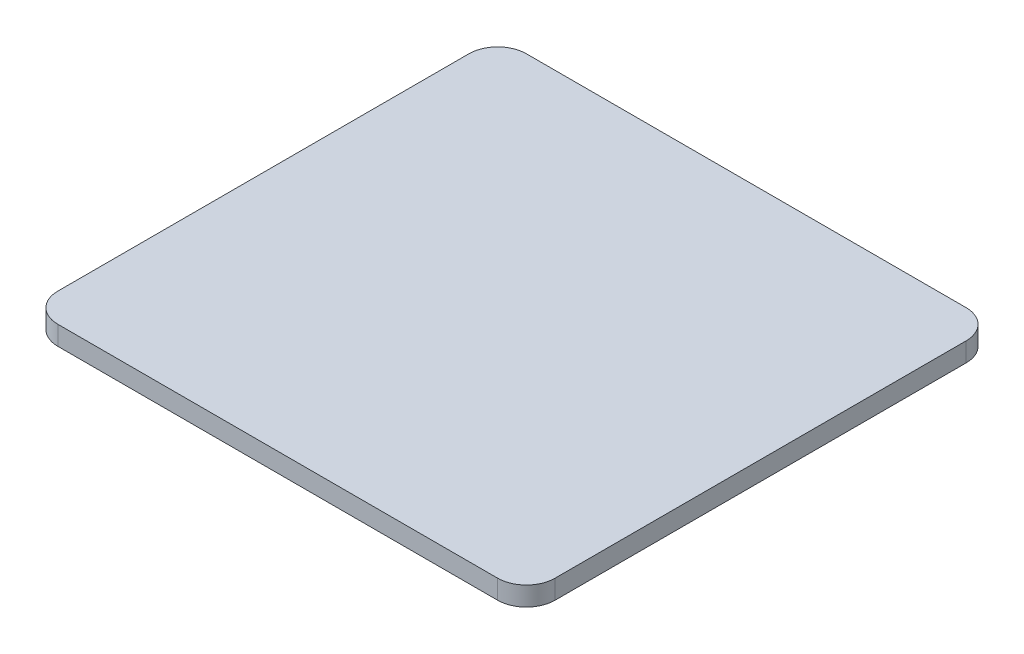
ISO-10303-21;
HEADER;
FILE_DESCRIPTION(('STEP AP214'),'2;1');
FILE_NAME('part.step','',(''),(''),'','','');
FILE_SCHEMA(('AUTOMOTIVE_DESIGN { 1 0 10303 214 1 1 1 1 }'));
ENDSEC;
DATA;
#1=APPLICATION_CONTEXT('core data for automotive mechanical design processes');
#2=APPLICATION_PROTOCOL_DEFINITION('international standard','automotive_design',2000,#1);
#3=PRODUCT_CONTEXT('',#1,'mechanical');
#4=PRODUCT('Part','Part','',(#3));
#5=PRODUCT_RELATED_PRODUCT_CATEGORY('part','',(#4));
#6=PRODUCT_DEFINITION_FORMATION('','',#4);
#7=PRODUCT_DEFINITION_CONTEXT('part definition',#1,'design');
#8=PRODUCT_DEFINITION('design','',#6,#7);
#9=PRODUCT_DEFINITION_SHAPE('','',#8);
#10=(LENGTH_UNIT() NAMED_UNIT(*) SI_UNIT(.MILLI.,.METRE.));
#11=(NAMED_UNIT(*) PLANE_ANGLE_UNIT() SI_UNIT($,.RADIAN.));
#12=(NAMED_UNIT(*) SI_UNIT($,.STERADIAN.) SOLID_ANGLE_UNIT());
#13=UNCERTAINTY_MEASURE_WITH_UNIT(LENGTH_MEASURE(1.E-05),#10,'distance_accuracy_value','');
#14=(GEOMETRIC_REPRESENTATION_CONTEXT(3) GLOBAL_UNCERTAINTY_ASSIGNED_CONTEXT((#13)) GLOBAL_UNIT_ASSIGNED_CONTEXT((#10,
#11,#12)) REPRESENTATION_CONTEXT('',''));
#15=CARTESIAN_POINT('',(0.,0.,0.));
#16=DIRECTION('',(0.,0.,1.));
#17=DIRECTION('',(1.,0.,0.));
#18=AXIS2_PLACEMENT_3D('',#15,#16,#17);
#19=CARTESIAN_POINT('',(-91.015948434079,2.,-50.8359001725532));
#20=DIRECTION('',(0.,0.,1.));
#21=DIRECTION('',(1.,0.,0.));
#22=AXIS2_PLACEMENT_3D('',#19,#20,#21);
#23=PLANE('',#22);
#24=DIRECTION('',(-1.,0.,0.));
#25=VECTOR('',#24,1.);
#26=CARTESIAN_POINT('',(-91.015948434079,2.,-50.8359001725532));
#27=LINE('',#26,#25);
#28=CARTESIAN_POINT('',(-42.015948434079,2.,-50.8359001725532));
#29=VERTEX_POINT('',#28);
#30=CARTESIAN_POINT('',(-88.015948434079,2.,-50.8359001725532));
#31=VERTEX_POINT('',#30);
#32=EDGE_CURVE('E133',#29,#31,#27,.T.);
#33=ORIENTED_EDGE('',*,*,#32,.F.);
#34=DIRECTION('',(0.,-1.,0.));
#35=VECTOR('',#34,1.);
#36=CARTESIAN_POINT('',(-42.015948434079,2.,-50.8359001725532));
#37=LINE('',#36,#35);
#38=CARTESIAN_POINT('',(-42.015948434079,0.,-50.8359001725532));
#39=VERTEX_POINT('',#38);
#40=EDGE_CURVE('E117',#29,#39,#37,.T.);
#41=ORIENTED_EDGE('',*,*,#40,.T.);
#42=DIRECTION('',(-1.,0.,0.));
#43=VECTOR('',#42,1.);
#44=CARTESIAN_POINT('',(-91.015948434079,0.,-50.8359001725532));
#45=LINE('',#44,#43);
#46=CARTESIAN_POINT('',(-88.015948434079,0.,-50.8359001725532));
#47=VERTEX_POINT('',#46);
#48=EDGE_CURVE('E130',#39,#47,#45,.T.);
#49=ORIENTED_EDGE('',*,*,#48,.T.);
#50=DIRECTION('',(0.,-1.,0.));
#51=VECTOR('',#50,1.);
#52=CARTESIAN_POINT('',(-88.015948434079,2.,-50.8359001725532));
#53=LINE('',#52,#51);
#54=EDGE_CURVE('E136',#47,#31,#53,.F.);
#55=ORIENTED_EDGE('',*,*,#54,.T.);
#56=EDGE_LOOP('',(#33,#41,#49,#55));
#57=FACE_BOUND('',#56,.T.);
#58=ADVANCED_FACE('F45',(#57),#23,.F.);
#59=CARTESIAN_POINT('',(-91.015948434079,2.,-50.8359001725532));
#60=DIRECTION('',(1.,0.,0.));
#61=DIRECTION('',(0.,0.,-1.));
#62=AXIS2_PLACEMENT_3D('',#59,#60,#61);
#63=PLANE('',#62);
#64=DIRECTION('',(0.,0.,1.));
#65=VECTOR('',#64,1.);
#66=CARTESIAN_POINT('',(-91.015948434079,2.,-50.8359001725532));
#67=LINE('',#66,#65);
#68=CARTESIAN_POINT('',(-91.015948434079,2.,-47.8359001725532));
#69=VERTEX_POINT('',#68);
#70=CARTESIAN_POINT('',(-91.015948434079,2.,-4.8359001725532));
#71=VERTEX_POINT('',#70);
#72=EDGE_CURVE('E200',#69,#71,#67,.T.);
#73=ORIENTED_EDGE('',*,*,#72,.F.);
#74=DIRECTION('',(0.,-1.,0.));
#75=VECTOR('',#74,1.);
#76=CARTESIAN_POINT('',(-91.015948434079,2.,-47.8359001725532));
#77=LINE('',#76,#75);
#78=CARTESIAN_POINT('',(-91.015948434079,0.,-47.8359001725532));
#79=VERTEX_POINT('',#78);
#80=EDGE_CURVE('E11',#69,#79,#77,.T.);
#81=ORIENTED_EDGE('',*,*,#80,.T.);
#82=DIRECTION('',(0.,0.,1.));
#83=VECTOR('',#82,1.);
#84=CARTESIAN_POINT('',(-91.015948434079,0.,-50.8359001725532));
#85=LINE('',#84,#83);
#86=CARTESIAN_POINT('',(-91.015948434079,0.,-4.8359001725532));
#87=VERTEX_POINT('',#86);
#88=EDGE_CURVE('E142',#79,#87,#85,.T.);
#89=ORIENTED_EDGE('',*,*,#88,.T.);
#90=DIRECTION('',(0.,-1.,0.));
#91=VECTOR('',#90,1.);
#92=CARTESIAN_POINT('',(-91.015948434079,2.,-4.8359001725532));
#93=LINE('',#92,#91);
#94=EDGE_CURVE('E54',#87,#71,#93,.F.);
#95=ORIENTED_EDGE('',*,*,#94,.T.);
#96=EDGE_LOOP('',(#73,#81,#89,#95));
#97=FACE_BOUND('',#96,.T.);
#98=ADVANCED_FACE('F199',(#97),#63,.F.);
#99=CARTESIAN_POINT('',(-91.015948434079,2.,-1.8359001725532));
#100=DIRECTION('',(0.,0.,-1.));
#101=DIRECTION('',(-1.,0.,0.));
#102=AXIS2_PLACEMENT_3D('',#99,#100,#101);
#103=PLANE('',#102);
#104=DIRECTION('',(1.,0.,0.));
#105=VECTOR('',#104,1.);
#106=CARTESIAN_POINT('',(-91.015948434079,0.,-1.8359001725532));
#107=LINE('',#106,#105);
#108=CARTESIAN_POINT('',(-88.015948434079,0.,-1.8359001725532));
#109=VERTEX_POINT('',#108);
#110=CARTESIAN_POINT('',(-42.015948434079,0.,-1.8359001725532));
#111=VERTEX_POINT('',#110);
#112=EDGE_CURVE('E148',#109,#111,#107,.T.);
#113=ORIENTED_EDGE('',*,*,#112,.T.);
#114=DIRECTION('',(0.,-1.,0.));
#115=VECTOR('',#114,1.);
#116=CARTESIAN_POINT('',(-42.015948434079,2.,-1.8359001725532));
#117=LINE('',#116,#115);
#118=CARTESIAN_POINT('',(-42.015948434079,2.,-1.8359001725532));
#119=VERTEX_POINT('',#118);
#120=EDGE_CURVE('E61',#111,#119,#117,.F.);
#121=ORIENTED_EDGE('',*,*,#120,.T.);
#122=DIRECTION('',(1.,0.,0.));
#123=VECTOR('',#122,1.);
#124=CARTESIAN_POINT('',(-91.015948434079,2.,-1.8359001725532));
#125=LINE('',#124,#123);
#126=CARTESIAN_POINT('',(-88.015948434079,2.,-1.8359001725532));
#127=VERTEX_POINT('',#126);
#128=EDGE_CURVE('E207',#127,#119,#125,.T.);
#129=ORIENTED_EDGE('',*,*,#128,.F.);
#130=DIRECTION('',(0.,-1.,0.));
#131=VECTOR('',#130,1.);
#132=CARTESIAN_POINT('',(-88.015948434079,2.,-1.8359001725532));
#133=LINE('',#132,#131);
#134=EDGE_CURVE('E190',#127,#109,#133,.T.);
#135=ORIENTED_EDGE('',*,*,#134,.T.);
#136=EDGE_LOOP('',(#113,#121,#129,#135));
#137=FACE_BOUND('',#136,.T.);
#138=ADVANCED_FACE('F211',(#137),#103,.F.);
#139=CARTESIAN_POINT('',(-39.015948434079,2.,-50.8359001725532));
#140=DIRECTION('',(-1.,0.,0.));
#141=DIRECTION('',(0.,0.,1.));
#142=AXIS2_PLACEMENT_3D('',#139,#140,#141);
#143=PLANE('',#142);
#144=DIRECTION('',(0.,0.,-1.));
#145=VECTOR('',#144,1.);
#146=CARTESIAN_POINT('',(-39.015948434079,0.,-50.8359001725532));
#147=LINE('',#146,#145);
#148=CARTESIAN_POINT('',(-39.015948434079,0.,-4.8359001725532));
#149=VERTEX_POINT('',#148);
#150=CARTESIAN_POINT('',(-39.015948434079,0.,-47.8359001725532));
#151=VERTEX_POINT('',#150);
#152=EDGE_CURVE('E159',#149,#151,#147,.T.);
#153=ORIENTED_EDGE('',*,*,#152,.T.);
#154=DIRECTION('',(0.,-1.,0.));
#155=VECTOR('',#154,1.);
#156=CARTESIAN_POINT('',(-39.015948434079,2.,-47.8359001725532));
#157=LINE('',#156,#155);
#158=CARTESIAN_POINT('',(-39.015948434079,2.,-47.8359001725532));
#159=VERTEX_POINT('',#158);
#160=EDGE_CURVE('E118',#151,#159,#157,.F.);
#161=ORIENTED_EDGE('',*,*,#160,.T.);
#162=DIRECTION('',(0.,0.,-1.));
#163=VECTOR('',#162,1.);
#164=CARTESIAN_POINT('',(-39.015948434079,2.,-50.8359001725532));
#165=LINE('',#164,#163);
#166=CARTESIAN_POINT('',(-39.015948434079,2.,-4.8359001725532));
#167=VERTEX_POINT('',#166);
#168=EDGE_CURVE('E154',#167,#159,#165,.T.);
#169=ORIENTED_EDGE('',*,*,#168,.F.);
#170=DIRECTION('',(0.,-1.,0.));
#171=VECTOR('',#170,1.);
#172=CARTESIAN_POINT('',(-39.015948434079,2.,-4.8359001725532));
#173=LINE('',#172,#171);
#174=EDGE_CURVE('E124',#167,#149,#173,.T.);
#175=ORIENTED_EDGE('',*,*,#174,.T.);
#176=EDGE_LOOP('',(#153,#161,#169,#175));
#177=FACE_BOUND('',#176,.T.);
#178=ADVANCED_FACE('F218',(#177),#143,.F.);
#179=CARTESIAN_POINT('',(0.,2.,0.));
#180=DIRECTION('',(0.,-1.,0.));
#181=DIRECTION('',(0.,0.,-1.));
#182=AXIS2_PLACEMENT_3D('',#179,#180,#181);
#183=PLANE('',#182);
#184=ORIENTED_EDGE('',*,*,#168,.T.);
#185=CARTESIAN_POINT('',(-42.015948434079,2.,-47.8359001725532));
#186=DIRECTION('',(0.,-1.,0.));
#187=DIRECTION('',(0.,0.,-1.));
#188=AXIS2_PLACEMENT_3D('',#185,#186,#187);
#189=CIRCLE('',#188,3.);
#190=EDGE_CURVE('E187',#159,#29,#189,.F.);
#191=ORIENTED_EDGE('',*,*,#190,.T.);
#192=ORIENTED_EDGE('',*,*,#32,.T.);
#193=CARTESIAN_POINT('',(-88.015948434079,2.,-47.8359001725532));
#194=DIRECTION('',(0.,-1.,0.));
#195=DIRECTION('',(0.,0.,-1.));
#196=AXIS2_PLACEMENT_3D('',#193,#194,#195);
#197=CIRCLE('',#196,3.);
#198=EDGE_CURVE('E181',#31,#69,#197,.F.);
#199=ORIENTED_EDGE('',*,*,#198,.T.);
#200=ORIENTED_EDGE('',*,*,#72,.T.);
#201=CARTESIAN_POINT('',(-88.015948434079,2.,-4.8359001725532));
#202=DIRECTION('',(0.,-1.,0.));
#203=DIRECTION('',(0.,0.,-1.));
#204=AXIS2_PLACEMENT_3D('',#201,#202,#203);
#205=CIRCLE('',#204,3.);
#206=EDGE_CURVE('E68',#71,#127,#205,.F.);
#207=ORIENTED_EDGE('',*,*,#206,.T.);
#208=ORIENTED_EDGE('',*,*,#128,.T.);
#209=CARTESIAN_POINT('',(-42.015948434079,2.,-4.8359001725532));
#210=DIRECTION('',(0.,-1.,0.));
#211=DIRECTION('',(0.,0.,-1.));
#212=AXIS2_PLACEMENT_3D('',#209,#210,#211);
#213=CIRCLE('',#212,3.);
#214=EDGE_CURVE('E184',#119,#167,#213,.F.);
#215=ORIENTED_EDGE('',*,*,#214,.T.);
#216=EDGE_LOOP('',(#184,#191,#192,#199,#200,#207,#208,#215));
#217=FACE_BOUND('',#216,.T.);
#218=ADVANCED_FACE('F204',(#217),#183,.F.);
#219=CARTESIAN_POINT('',(0.,0.,0.));
#220=DIRECTION('',(0.,-1.,0.));
#221=DIRECTION('',(0.,0.,-1.));
#222=AXIS2_PLACEMENT_3D('',#219,#220,#221);
#223=PLANE('',#222);
#224=CARTESIAN_POINT('',(-62.015948434079,0.,-26.3359001725532));
#225=DIRECTION('',(0.,-1.,0.));
#226=DIRECTION('',(0.,0.,-1.));
#227=AXIS2_PLACEMENT_3D('',#224,#225,#226);
#228=CIRCLE('',#227,3.50000000000001);
#229=CARTESIAN_POINT('',(-62.015948434079,0.,-29.8359001725532));
#230=VERTEX_POINT('',#229);
#231=EDGE_CURVE('E151',#230,#230,#228,.T.);
#232=ORIENTED_EDGE('',*,*,#231,.F.);
#233=EDGE_LOOP('',(#232));
#234=FACE_BOUND('',#233,.T.);
#235=ORIENTED_EDGE('',*,*,#48,.F.);
#236=CARTESIAN_POINT('',(-42.015948434079,0.,-47.8359001725532));
#237=DIRECTION('',(0.,-1.,0.));
#238=DIRECTION('',(0.,0.,-1.));
#239=AXIS2_PLACEMENT_3D('',#236,#237,#238);
#240=CIRCLE('',#239,3.);
#241=EDGE_CURVE('E113',#39,#151,#240,.T.);
#242=ORIENTED_EDGE('',*,*,#241,.T.);
#243=ORIENTED_EDGE('',*,*,#152,.F.);
#244=CARTESIAN_POINT('',(-42.015948434079,0.,-4.8359001725532));
#245=DIRECTION('',(0.,-1.,0.));
#246=DIRECTION('',(0.,0.,-1.));
#247=AXIS2_PLACEMENT_3D('',#244,#245,#246);
#248=CIRCLE('',#247,3.);
#249=EDGE_CURVE('E125',#149,#111,#248,.T.);
#250=ORIENTED_EDGE('',*,*,#249,.T.);
#251=ORIENTED_EDGE('',*,*,#112,.F.);
#252=CARTESIAN_POINT('',(-88.015948434079,0.,-4.8359001725532));
#253=DIRECTION('',(0.,-1.,0.));
#254=DIRECTION('',(0.,0.,-1.));
#255=AXIS2_PLACEMENT_3D('',#252,#253,#254);
#256=CIRCLE('',#255,3.);
#257=EDGE_CURVE('E135',#109,#87,#256,.T.);
#258=ORIENTED_EDGE('',*,*,#257,.T.);
#259=ORIENTED_EDGE('',*,*,#88,.F.);
#260=CARTESIAN_POINT('',(-88.015948434079,0.,-47.8359001725532));
#261=DIRECTION('',(0.,-1.,0.));
#262=DIRECTION('',(0.,0.,-1.));
#263=AXIS2_PLACEMENT_3D('',#260,#261,#262);
#264=CIRCLE('',#263,3.);
#265=EDGE_CURVE('E140',#79,#47,#264,.T.);
#266=ORIENTED_EDGE('',*,*,#265,.T.);
#267=EDGE_LOOP('',(#235,#242,#243,#250,#251,#258,#259,#266));
#268=FACE_BOUND('',#267,.T.);
#269=ADVANCED_FACE('F138',(#234,#268),#223,.T.);
#270=CARTESIAN_POINT('',(-62.015948434079,-3.,-26.3359001725532));
#271=DIRECTION('',(0.,-1.,0.));
#272=DIRECTION('',(0.,0.,-1.));
#273=AXIS2_PLACEMENT_3D('',#270,#271,#272);
#274=PLANE('',#273);
#275=CARTESIAN_POINT('',(-62.015948434079,-3.,-26.3359001725532));
#276=DIRECTION('',(0.,-1.,0.));
#277=DIRECTION('',(0.,0.,-1.));
#278=AXIS2_PLACEMENT_3D('',#275,#276,#277);
#279=CIRCLE('',#278,3.50000000000001);
#280=CARTESIAN_POINT('',(-62.015948434079,-3.,-29.8359001725532));
#281=VERTEX_POINT('',#280);
#282=EDGE_CURVE('E143',#281,#281,#279,.T.);
#283=ORIENTED_EDGE('',*,*,#282,.T.);
#284=EDGE_LOOP('',(#283));
#285=FACE_BOUND('',#284,.T.);
#286=CARTESIAN_POINT('',(-62.015948434079,-3.,-26.3359001725532));
#287=DIRECTION('',(0.,-1.,0.));
#288=DIRECTION('',(0.,0.,-1.));
#289=AXIS2_PLACEMENT_3D('',#286,#287,#288);
#290=CIRCLE('',#289,2.49999999999999);
#291=CARTESIAN_POINT('',(-62.015948434079,-3.,-28.8359001725532));
#292=VERTEX_POINT('',#291);
#293=EDGE_CURVE('E226',#292,#292,#290,.T.);
#294=ORIENTED_EDGE('',*,*,#293,.F.);
#295=EDGE_LOOP('',(#294));
#296=FACE_BOUND('',#295,.T.);
#297=ADVANCED_FACE('F235',(#285,#296),#274,.T.);
#298=CARTESIAN_POINT('',(-62.015948434079,-3.,-26.3359001725532));
#299=DIRECTION('',(0.,1.,0.));
#300=DIRECTION('',(0.,0.,1.));
#301=AXIS2_PLACEMENT_3D('',#298,#299,#300);
#302=CYLINDRICAL_SURFACE('',#301,3.50000000000001);
#303=ORIENTED_EDGE('',*,*,#282,.F.);
#304=EDGE_LOOP('',(#303));
#305=FACE_BOUND('',#304,.T.);
#306=ORIENTED_EDGE('',*,*,#231,.T.);
#307=EDGE_LOOP('',(#306));
#308=FACE_BOUND('',#307,.T.);
#309=ADVANCED_FACE('F237',(#305,#308),#302,.T.);
#310=CARTESIAN_POINT('',(-62.015948434079,-3.,-26.3359001725532));
#311=DIRECTION('',(0.,1.,0.));
#312=DIRECTION('',(0.,0.,1.));
#313=AXIS2_PLACEMENT_3D('',#310,#311,#312);
#314=CYLINDRICAL_SURFACE('',#313,2.49999999999999);
#315=ORIENTED_EDGE('',*,*,#293,.T.);
#316=EDGE_LOOP('',(#315));
#317=FACE_BOUND('',#316,.T.);
#318=CARTESIAN_POINT('',(-62.015948434079,0.,-26.3359001725532));
#319=DIRECTION('',(0.,-1.,0.));
#320=DIRECTION('',(0.,0.,-1.));
#321=AXIS2_PLACEMENT_3D('',#318,#319,#320);
#322=CIRCLE('',#321,2.49999999999999);
#323=CARTESIAN_POINT('',(-62.015948434079,0.,-28.8359001725532));
#324=VERTEX_POINT('',#323);
#325=EDGE_CURVE('E162',#324,#324,#322,.F.);
#326=ORIENTED_EDGE('',*,*,#325,.T.);
#327=EDGE_LOOP('',(#326));
#328=FACE_BOUND('',#327,.T.);
#329=ADVANCED_FACE('F232',(#317,#328),#314,.F.);
#330=ORIENTED_EDGE('',*,*,#325,.F.);
#331=EDGE_LOOP('',(#330));
#332=FACE_BOUND('',#331,.T.);
#333=ADVANCED_FACE('F248',(#332),#223,.T.);
#334=CARTESIAN_POINT('',(-42.015948434079,2.,-47.8359001725532));
#335=DIRECTION('',(0.,-1.,0.));
#336=DIRECTION('',(0.,0.,-1.));
#337=AXIS2_PLACEMENT_3D('',#334,#335,#336);
#338=CYLINDRICAL_SURFACE('',#337,3.);
#339=ORIENTED_EDGE('',*,*,#190,.F.);
#340=ORIENTED_EDGE('',*,*,#160,.F.);
#341=ORIENTED_EDGE('',*,*,#241,.F.);
#342=ORIENTED_EDGE('',*,*,#40,.F.);
#343=EDGE_LOOP('',(#339,#340,#341,#342));
#344=FACE_BOUND('',#343,.T.);
#345=ADVANCED_FACE('F116',(#344),#338,.T.);
#346=CARTESIAN_POINT('',(-42.015948434079,2.,-4.8359001725532));
#347=DIRECTION('',(0.,-1.,0.));
#348=DIRECTION('',(0.,0.,-1.));
#349=AXIS2_PLACEMENT_3D('',#346,#347,#348);
#350=CYLINDRICAL_SURFACE('',#349,3.);
#351=ORIENTED_EDGE('',*,*,#214,.F.);
#352=ORIENTED_EDGE('',*,*,#120,.F.);
#353=ORIENTED_EDGE('',*,*,#249,.F.);
#354=ORIENTED_EDGE('',*,*,#174,.F.);
#355=EDGE_LOOP('',(#351,#352,#353,#354));
#356=FACE_BOUND('',#355,.T.);
#357=ADVANCED_FACE('F215',(#356),#350,.T.);
#358=CARTESIAN_POINT('',(-88.015948434079,2.,-47.8359001725532));
#359=DIRECTION('',(0.,-1.,0.));
#360=DIRECTION('',(0.,0.,-1.));
#361=AXIS2_PLACEMENT_3D('',#358,#359,#360);
#362=CYLINDRICAL_SURFACE('',#361,3.);
#363=ORIENTED_EDGE('',*,*,#198,.F.);
#364=ORIENTED_EDGE('',*,*,#54,.F.);
#365=ORIENTED_EDGE('',*,*,#265,.F.);
#366=ORIENTED_EDGE('',*,*,#80,.F.);
#367=EDGE_LOOP('',(#363,#364,#365,#366));
#368=FACE_BOUND('',#367,.T.);
#369=ADVANCED_FACE('F262',(#368),#362,.T.);
#370=CARTESIAN_POINT('',(-88.015948434079,2.,-4.8359001725532));
#371=DIRECTION('',(0.,-1.,0.));
#372=DIRECTION('',(0.,0.,-1.));
#373=AXIS2_PLACEMENT_3D('',#370,#371,#372);
#374=CYLINDRICAL_SURFACE('',#373,3.);
#375=ORIENTED_EDGE('',*,*,#206,.F.);
#376=ORIENTED_EDGE('',*,*,#94,.F.);
#377=ORIENTED_EDGE('',*,*,#257,.F.);
#378=ORIENTED_EDGE('',*,*,#134,.F.);
#379=EDGE_LOOP('',(#375,#376,#377,#378));
#380=FACE_BOUND('',#379,.T.);
#381=ADVANCED_FACE('F47',(#380),#374,.T.);
#382=CLOSED_SHELL('',(#58,#98,#138,#178,#218,#269,#297,#309,#329,#333,#345,#357,#369,#381));
#383=MANIFOLD_SOLID_BREP('B2',#382);
#384=ADVANCED_BREP_SHAPE_REPRESENTATION('',(#18,#383),#14);
#385=SHAPE_DEFINITION_REPRESENTATION(#9,#384);
ENDSEC;
END-ISO-10303-21;
